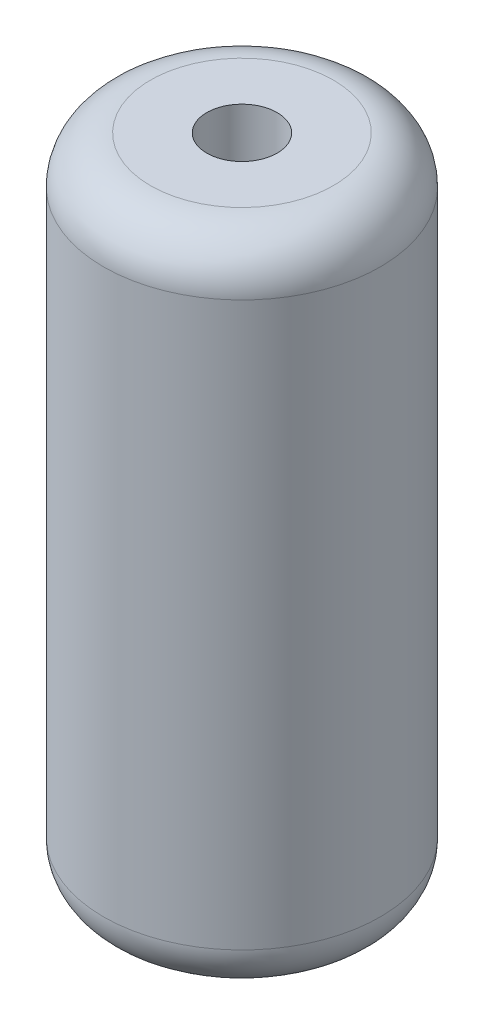
ISO-10303-21;
HEADER;
FILE_DESCRIPTION(('STEP AP214'),'2;1');
FILE_NAME('part.step','',(''),(''),'','','');
FILE_SCHEMA(('AUTOMOTIVE_DESIGN { 1 0 10303 214 1 1 1 1 }'));
ENDSEC;
DATA;
#1=APPLICATION_CONTEXT('core data for automotive mechanical design processes');
#2=APPLICATION_PROTOCOL_DEFINITION('international standard','automotive_design',2000,#1);
#3=PRODUCT_CONTEXT('',#1,'mechanical');
#4=PRODUCT('Part','Part','',(#3));
#5=PRODUCT_RELATED_PRODUCT_CATEGORY('part','',(#4));
#6=PRODUCT_DEFINITION_FORMATION('','',#4);
#7=PRODUCT_DEFINITION_CONTEXT('part definition',#1,'design');
#8=PRODUCT_DEFINITION('design','',#6,#7);
#9=PRODUCT_DEFINITION_SHAPE('','',#8);
#10=(LENGTH_UNIT() NAMED_UNIT(*) SI_UNIT(.MILLI.,.METRE.));
#11=(NAMED_UNIT(*) PLANE_ANGLE_UNIT() SI_UNIT($,.RADIAN.));
#12=(NAMED_UNIT(*) SI_UNIT($,.STERADIAN.) SOLID_ANGLE_UNIT());
#13=UNCERTAINTY_MEASURE_WITH_UNIT(LENGTH_MEASURE(1.E-05),#10,'distance_accuracy_value','');
#14=(GEOMETRIC_REPRESENTATION_CONTEXT(3) GLOBAL_UNCERTAINTY_ASSIGNED_CONTEXT((#13)) GLOBAL_UNIT_ASSIGNED_CONTEXT((#10,
#11,#12)) REPRESENTATION_CONTEXT('',''));
#15=CARTESIAN_POINT('',(0.,0.,0.));
#16=DIRECTION('',(0.,0.,1.));
#17=DIRECTION('',(1.,0.,0.));
#18=AXIS2_PLACEMENT_3D('',#15,#16,#17);
#19=CARTESIAN_POINT('',(0.,70.,0.));
#20=DIRECTION('',(0.,-1.,0.));
#21=DIRECTION('',(0.,0.,-1.));
#22=AXIS2_PLACEMENT_3D('',#19,#20,#21);
#23=CYLINDRICAL_SURFACE('',#22,29.5);
#24=CARTESIAN_POINT('',(0.,-60.,0.));
#25=DIRECTION('',(0.,1.,0.));
#26=DIRECTION('',(0.,0.,1.));
#27=AXIS2_PLACEMENT_3D('',#24,#25,#26);
#28=CIRCLE('',#27,29.5);
#29=CARTESIAN_POINT('',(0.,-60.,29.5));
#30=VERTEX_POINT('',#29);
#31=EDGE_CURVE('E41',#30,#30,#28,.T.);
#32=ORIENTED_EDGE('',*,*,#31,.T.);
#33=EDGE_LOOP('',(#32));
#34=FACE_BOUND('',#33,.T.);
#35=CARTESIAN_POINT('',(0.,60.,0.));
#36=DIRECTION('',(0.,1.,0.));
#37=DIRECTION('',(0.,0.,1.));
#38=AXIS2_PLACEMENT_3D('',#35,#36,#37);
#39=CIRCLE('',#38,29.5);
#40=CARTESIAN_POINT('',(0.,60.,29.5));
#41=VERTEX_POINT('',#40);
#42=EDGE_CURVE('E45',#41,#41,#39,.F.);
#43=ORIENTED_EDGE('',*,*,#42,.T.);
#44=EDGE_LOOP('',(#43));
#45=FACE_BOUND('',#44,.T.);
#46=ADVANCED_FACE('F30',(#34,#45),#23,.T.);
#47=CARTESIAN_POINT('',(0.,70.,0.));
#48=DIRECTION('',(0.,1.,0.));
#49=DIRECTION('',(0.,0.,1.));
#50=AXIS2_PLACEMENT_3D('',#47,#48,#49);
#51=PLANE('',#50);
#52=CARTESIAN_POINT('',(0.,70.,0.));
#53=DIRECTION('',(0.,1.,0.));
#54=DIRECTION('',(0.,0.,1.));
#55=AXIS2_PLACEMENT_3D('',#52,#53,#54);
#56=CIRCLE('',#55,7.5);
#57=CARTESIAN_POINT('',(0.,70.,7.5));
#58=VERTEX_POINT('',#57);
#59=EDGE_CURVE('E51',#58,#58,#56,.T.);
#60=ORIENTED_EDGE('',*,*,#59,.F.);
#61=EDGE_LOOP('',(#60));
#62=FACE_BOUND('',#61,.T.);
#63=CARTESIAN_POINT('',(0.,70.,0.));
#64=DIRECTION('',(0.,1.,0.));
#65=DIRECTION('',(0.,0.,1.));
#66=AXIS2_PLACEMENT_3D('',#63,#64,#65);
#67=CIRCLE('',#66,19.5);
#68=CARTESIAN_POINT('',(0.,70.,19.5));
#69=VERTEX_POINT('',#68);
#70=EDGE_CURVE('E10',#69,#69,#67,.T.);
#71=ORIENTED_EDGE('',*,*,#70,.T.);
#72=EDGE_LOOP('',(#71));
#73=FACE_BOUND('',#72,.T.);
#74=ADVANCED_FACE('F65',(#62,#73),#51,.T.);
#75=CARTESIAN_POINT('',(0.,-70.,0.));
#76=DIRECTION('',(0.,1.,0.));
#77=DIRECTION('',(0.,0.,1.));
#78=AXIS2_PLACEMENT_3D('',#75,#76,#77);
#79=PLANE('',#78);
#80=CARTESIAN_POINT('',(0.,-70.,0.));
#81=DIRECTION('',(0.,1.,0.));
#82=DIRECTION('',(0.,0.,1.));
#83=AXIS2_PLACEMENT_3D('',#80,#81,#82);
#84=CIRCLE('',#83,7.5);
#85=CARTESIAN_POINT('',(0.,-70.,7.5));
#86=VERTEX_POINT('',#85);
#87=EDGE_CURVE('E50',#86,#86,#84,.T.);
#88=ORIENTED_EDGE('',*,*,#87,.T.);
#89=EDGE_LOOP('',(#88));
#90=FACE_BOUND('',#89,.T.);
#91=CARTESIAN_POINT('',(0.,-70.,0.));
#92=DIRECTION('',(0.,1.,0.));
#93=DIRECTION('',(0.,0.,1.));
#94=AXIS2_PLACEMENT_3D('',#91,#92,#93);
#95=CIRCLE('',#94,19.5);
#96=CARTESIAN_POINT('',(0.,-70.,19.5));
#97=VERTEX_POINT('',#96);
#98=EDGE_CURVE('E37',#97,#97,#95,.F.);
#99=ORIENTED_EDGE('',*,*,#98,.T.);
#100=EDGE_LOOP('',(#99));
#101=FACE_BOUND('',#100,.T.);
#102=ADVANCED_FACE('F57',(#90,#101),#79,.F.);
#103=CARTESIAN_POINT('',(0.,-60.,0.));
#104=DIRECTION('',(0.,1.,0.));
#105=DIRECTION('',(0.,0.,1.));
#106=AXIS2_PLACEMENT_3D('',#103,#104,#105);
#107=TOROIDAL_SURFACE('',#106,19.5,10.);
#108=ORIENTED_EDGE('',*,*,#98,.F.);
#109=EDGE_LOOP('',(#108));
#110=FACE_BOUND('',#109,.T.);
#111=ORIENTED_EDGE('',*,*,#31,.F.);
#112=EDGE_LOOP('',(#111));
#113=FACE_BOUND('',#112,.T.);
#114=ADVANCED_FACE('F72',(#110,#113),#107,.T.);
#115=CARTESIAN_POINT('',(0.,60.,0.));
#116=DIRECTION('',(0.,1.,0.));
#117=DIRECTION('',(0.,0.,1.));
#118=AXIS2_PLACEMENT_3D('',#115,#116,#117);
#119=TOROIDAL_SURFACE('',#118,19.5,10.);
#120=ORIENTED_EDGE('',*,*,#42,.F.);
#121=EDGE_LOOP('',(#120));
#122=FACE_BOUND('',#121,.T.);
#123=ORIENTED_EDGE('',*,*,#70,.F.);
#124=EDGE_LOOP('',(#123));
#125=FACE_BOUND('',#124,.T.);
#126=ADVANCED_FACE('F32',(#122,#125),#119,.T.);
#127=CARTESIAN_POINT('',(0.,-70.,0.));
#128=DIRECTION('',(0.,1.,0.));
#129=DIRECTION('',(0.,0.,1.));
#130=AXIS2_PLACEMENT_3D('',#127,#128,#129);
#131=CYLINDRICAL_SURFACE('',#130,7.5);
#132=ORIENTED_EDGE('',*,*,#87,.F.);
#133=EDGE_LOOP('',(#132));
#134=FACE_BOUND('',#133,.T.);
#135=ORIENTED_EDGE('',*,*,#59,.T.);
#136=EDGE_LOOP('',(#135));
#137=FACE_BOUND('',#136,.T.);
#138=ADVANCED_FACE('F59',(#134,#137),#131,.F.);
#139=CLOSED_SHELL('',(#46,#74,#102,#114,#126,#138));
#140=MANIFOLD_SOLID_BREP('B2',#139);
#141=ADVANCED_BREP_SHAPE_REPRESENTATION('',(#18,#140),#14);
#142=SHAPE_DEFINITION_REPRESENTATION(#9,#141);
ENDSEC;
END-ISO-10303-21;
